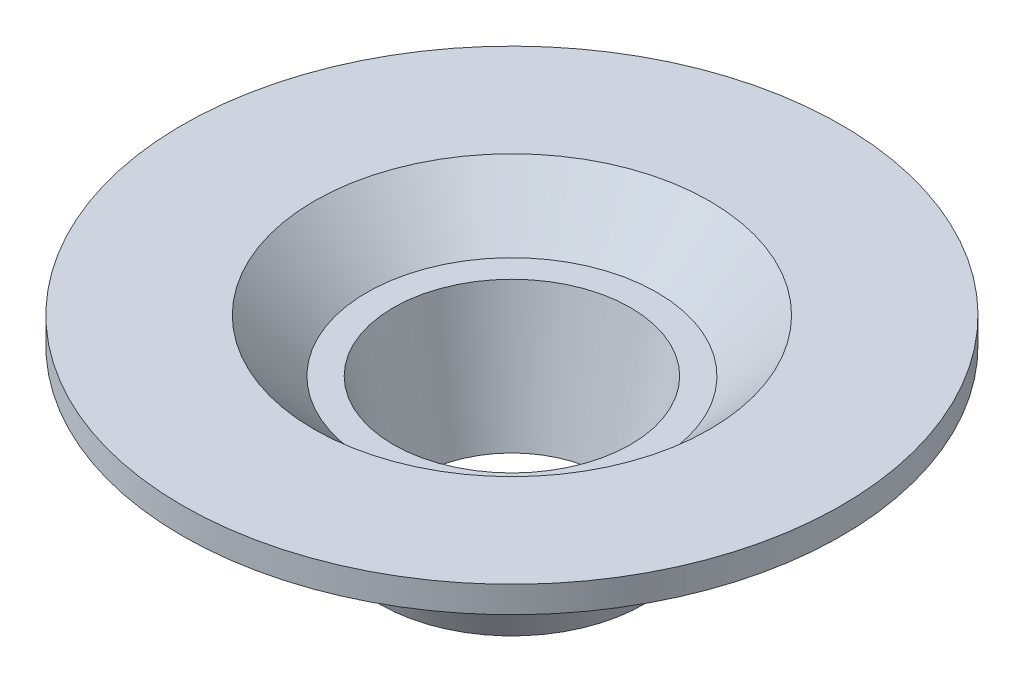
ISO-10303-21;
HEADER;
FILE_DESCRIPTION(('STEP AP214'),'2;1');
FILE_NAME('part.step','',(''),(''),'','','');
FILE_SCHEMA(('AUTOMOTIVE_DESIGN { 1 0 10303 214 1 1 1 1 }'));
ENDSEC;
DATA;
#1=APPLICATION_CONTEXT('core data for automotive mechanical design processes');
#2=APPLICATION_PROTOCOL_DEFINITION('international standard','automotive_design',2000,#1);
#3=PRODUCT_CONTEXT('',#1,'mechanical');
#4=PRODUCT('Part','Part','',(#3));
#5=PRODUCT_RELATED_PRODUCT_CATEGORY('part','',(#4));
#6=PRODUCT_DEFINITION_FORMATION('','',#4);
#7=PRODUCT_DEFINITION_CONTEXT('part definition',#1,'design');
#8=PRODUCT_DEFINITION('design','',#6,#7);
#9=PRODUCT_DEFINITION_SHAPE('','',#8);
#10=(LENGTH_UNIT() NAMED_UNIT(*) SI_UNIT(.MILLI.,.METRE.));
#11=(NAMED_UNIT(*) PLANE_ANGLE_UNIT() SI_UNIT($,.RADIAN.));
#12=(NAMED_UNIT(*) SI_UNIT($,.STERADIAN.) SOLID_ANGLE_UNIT());
#13=UNCERTAINTY_MEASURE_WITH_UNIT(LENGTH_MEASURE(1.E-05),#10,'distance_accuracy_value','');
#14=(GEOMETRIC_REPRESENTATION_CONTEXT(3) GLOBAL_UNCERTAINTY_ASSIGNED_CONTEXT((#13)) GLOBAL_UNIT_ASSIGNED_CONTEXT((#10,
#11,#12)) REPRESENTATION_CONTEXT('',''));
#15=CARTESIAN_POINT('',(0.,0.,0.));
#16=DIRECTION('',(0.,0.,1.));
#17=DIRECTION('',(1.,0.,0.));
#18=AXIS2_PLACEMENT_3D('',#15,#16,#17);
#19=CARTESIAN_POINT('',(0.,0.,-5.5));
#20=DIRECTION('',(0.,-1.,0.));
#21=DIRECTION('',(0.,0.,-1.));
#22=AXIS2_PLACEMENT_3D('',#19,#20,#21);
#23=PLANE('',#22);
#24=CARTESIAN_POINT('',(0.,0.,0.));
#25=DIRECTION('',(0.,1.,0.));
#26=DIRECTION('',(0.,0.,1.));
#27=AXIS2_PLACEMENT_3D('',#24,#25,#26);
#28=CIRCLE('',#27,4.5);
#29=CARTESIAN_POINT('',(0.,0.,4.5));
#30=VERTEX_POINT('',#29);
#31=EDGE_CURVE('E73',#30,#30,#28,.T.);
#32=ORIENTED_EDGE('',*,*,#31,.F.);
#33=EDGE_LOOP('',(#32));
#34=FACE_BOUND('',#33,.T.);
#35=CARTESIAN_POINT('',(0.,0.,0.));
#36=DIRECTION('',(0.,1.,0.));
#37=DIRECTION('',(0.,0.,1.));
#38=AXIS2_PLACEMENT_3D('',#35,#36,#37);
#39=CIRCLE('',#38,5.5);
#40=CARTESIAN_POINT('',(0.,0.,5.5));
#41=VERTEX_POINT('',#40);
#42=EDGE_CURVE('E10',#41,#41,#39,.T.);
#43=ORIENTED_EDGE('',*,*,#42,.T.);
#44=EDGE_LOOP('',(#43));
#45=FACE_BOUND('',#44,.T.);
#46=ADVANCED_FACE('F39',(#34,#45),#23,.F.);
#47=CARTESIAN_POINT('',(0.,2.,0.));
#48=DIRECTION('',(0.,1.,0.));
#49=DIRECTION('',(0.,0.,1.));
#50=AXIS2_PLACEMENT_3D('',#47,#48,#49);
#51=CONICAL_SURFACE('',#50,7.5,0.785398163397448);
#52=ORIENTED_EDGE('',*,*,#42,.F.);
#53=EDGE_LOOP('',(#52));
#54=FACE_BOUND('',#53,.T.);
#55=CARTESIAN_POINT('',(0.,2.,0.));
#56=DIRECTION('',(0.,1.,0.));
#57=DIRECTION('',(0.,0.,1.));
#58=AXIS2_PLACEMENT_3D('',#55,#56,#57);
#59=CIRCLE('',#58,7.5);
#60=CARTESIAN_POINT('',(0.,2.,7.5));
#61=VERTEX_POINT('',#60);
#62=EDGE_CURVE('E45',#61,#61,#59,.T.);
#63=ORIENTED_EDGE('',*,*,#62,.T.);
#64=EDGE_LOOP('',(#63));
#65=FACE_BOUND('',#64,.T.);
#66=ADVANCED_FACE('F80',(#54,#65),#51,.F.);
#67=CARTESIAN_POINT('',(0.,2.,-12.5));
#68=DIRECTION('',(0.,-1.,0.));
#69=DIRECTION('',(0.,0.,-1.));
#70=AXIS2_PLACEMENT_3D('',#67,#68,#69);
#71=PLANE('',#70);
#72=ORIENTED_EDGE('',*,*,#62,.F.);
#73=EDGE_LOOP('',(#72));
#74=FACE_BOUND('',#73,.T.);
#75=CARTESIAN_POINT('',(0.,2.,0.));
#76=DIRECTION('',(0.,1.,0.));
#77=DIRECTION('',(0.,0.,1.));
#78=AXIS2_PLACEMENT_3D('',#75,#76,#77);
#79=CIRCLE('',#78,12.5);
#80=CARTESIAN_POINT('',(0.,2.,12.5));
#81=VERTEX_POINT('',#80);
#82=EDGE_CURVE('E49',#81,#81,#79,.T.);
#83=ORIENTED_EDGE('',*,*,#82,.T.);
#84=EDGE_LOOP('',(#83));
#85=FACE_BOUND('',#84,.T.);
#86=ADVANCED_FACE('F84',(#74,#85),#71,.F.);
#87=CARTESIAN_POINT('',(0.,0.,0.));
#88=DIRECTION('',(0.,1.,0.));
#89=DIRECTION('',(0.,0.,1.));
#90=AXIS2_PLACEMENT_3D('',#87,#88,#89);
#91=CYLINDRICAL_SURFACE('',#90,12.5);
#92=ORIENTED_EDGE('',*,*,#82,.F.);
#93=EDGE_LOOP('',(#92));
#94=FACE_BOUND('',#93,.T.);
#95=CARTESIAN_POINT('',(0.,1.,0.));
#96=DIRECTION('',(0.,1.,0.));
#97=DIRECTION('',(0.,0.,1.));
#98=AXIS2_PLACEMENT_3D('',#95,#96,#97);
#99=CIRCLE('',#98,12.5);
#100=CARTESIAN_POINT('',(0.,1.,12.5));
#101=VERTEX_POINT('',#100);
#102=EDGE_CURVE('E53',#101,#101,#99,.T.);
#103=ORIENTED_EDGE('',*,*,#102,.T.);
#104=EDGE_LOOP('',(#103));
#105=FACE_BOUND('',#104,.T.);
#106=ADVANCED_FACE('F89',(#94,#105),#91,.T.);
#107=CARTESIAN_POINT('',(0.,1.,-10.5));
#108=DIRECTION('',(0.,1.,0.));
#109=DIRECTION('',(0.,0.,1.));
#110=AXIS2_PLACEMENT_3D('',#107,#108,#109);
#111=PLANE('',#110);
#112=ORIENTED_EDGE('',*,*,#102,.F.);
#113=EDGE_LOOP('',(#112));
#114=FACE_BOUND('',#113,.T.);
#115=CARTESIAN_POINT('',(0.,1.,0.));
#116=DIRECTION('',(0.,1.,0.));
#117=DIRECTION('',(0.,0.,1.));
#118=AXIS2_PLACEMENT_3D('',#115,#116,#117);
#119=CIRCLE('',#118,10.5);
#120=CARTESIAN_POINT('',(0.,1.,10.5));
#121=VERTEX_POINT('',#120);
#122=EDGE_CURVE('E58',#121,#121,#119,.T.);
#123=ORIENTED_EDGE('',*,*,#122,.T.);
#124=EDGE_LOOP('',(#123));
#125=FACE_BOUND('',#124,.T.);
#126=ADVANCED_FACE('F95',(#114,#125),#111,.F.);
#127=CARTESIAN_POINT('',(0.,-1.,0.));
#128=DIRECTION('',(0.,1.,0.));
#129=DIRECTION('',(0.,0.,1.));
#130=AXIS2_PLACEMENT_3D('',#127,#128,#129);
#131=CONICAL_SURFACE('',#130,8.5,0.785398163397448);
#132=ORIENTED_EDGE('',*,*,#122,.F.);
#133=EDGE_LOOP('',(#132));
#134=FACE_BOUND('',#133,.T.);
#135=CARTESIAN_POINT('',(0.,-1.,0.));
#136=DIRECTION('',(0.,1.,0.));
#137=DIRECTION('',(0.,0.,1.));
#138=AXIS2_PLACEMENT_3D('',#135,#136,#137);
#139=CIRCLE('',#138,8.5);
#140=CARTESIAN_POINT('',(0.,-1.,8.5));
#141=VERTEX_POINT('',#140);
#142=EDGE_CURVE('E61',#141,#141,#139,.T.);
#143=ORIENTED_EDGE('',*,*,#142,.T.);
#144=EDGE_LOOP('',(#143));
#145=FACE_BOUND('',#144,.T.);
#146=ADVANCED_FACE('F99',(#134,#145),#131,.T.);
#147=CARTESIAN_POINT('',(0.,-1.,-6.5));
#148=DIRECTION('',(0.,1.,0.));
#149=DIRECTION('',(0.,0.,1.));
#150=AXIS2_PLACEMENT_3D('',#147,#148,#149);
#151=PLANE('',#150);
#152=ORIENTED_EDGE('',*,*,#142,.F.);
#153=EDGE_LOOP('',(#152));
#154=FACE_BOUND('',#153,.T.);
#155=CARTESIAN_POINT('',(0.,-1.,0.));
#156=DIRECTION('',(0.,1.,0.));
#157=DIRECTION('',(0.,0.,1.));
#158=AXIS2_PLACEMENT_3D('',#155,#156,#157);
#159=CIRCLE('',#158,6.5);
#160=CARTESIAN_POINT('',(0.,-1.,6.5));
#161=VERTEX_POINT('',#160);
#162=EDGE_CURVE('E64',#161,#161,#159,.T.);
#163=ORIENTED_EDGE('',*,*,#162,.T.);
#164=EDGE_LOOP('',(#163));
#165=FACE_BOUND('',#164,.T.);
#166=ADVANCED_FACE('F103',(#154,#165),#151,.F.);
#167=CARTESIAN_POINT('',(0.,-5.,0.));
#168=DIRECTION('',(0.,1.,0.));
#169=DIRECTION('',(0.,0.,1.));
#170=AXIS2_PLACEMENT_3D('',#167,#168,#169);
#171=CONICAL_SURFACE('',#170,5.,0.358770670270572);
#172=ORIENTED_EDGE('',*,*,#162,.F.);
#173=EDGE_LOOP('',(#172));
#174=FACE_BOUND('',#173,.T.);
#175=CARTESIAN_POINT('',(0.,-5.,0.));
#176=DIRECTION('',(0.,1.,0.));
#177=DIRECTION('',(0.,0.,1.));
#178=AXIS2_PLACEMENT_3D('',#175,#176,#177);
#179=CIRCLE('',#178,5.);
#180=CARTESIAN_POINT('',(0.,-5.,5.));
#181=VERTEX_POINT('',#180);
#182=EDGE_CURVE('E67',#181,#181,#179,.T.);
#183=ORIENTED_EDGE('',*,*,#182,.T.);
#184=EDGE_LOOP('',(#183));
#185=FACE_BOUND('',#184,.T.);
#186=ADVANCED_FACE('F107',(#174,#185),#171,.T.);
#187=CARTESIAN_POINT('',(0.,-5.,-3.5));
#188=DIRECTION('',(0.,1.,0.));
#189=DIRECTION('',(0.,0.,1.));
#190=AXIS2_PLACEMENT_3D('',#187,#188,#189);
#191=PLANE('',#190);
#192=ORIENTED_EDGE('',*,*,#182,.F.);
#193=EDGE_LOOP('',(#192));
#194=FACE_BOUND('',#193,.T.);
#195=CARTESIAN_POINT('',(0.,-5.,0.));
#196=DIRECTION('',(0.,1.,0.));
#197=DIRECTION('',(0.,0.,1.));
#198=AXIS2_PLACEMENT_3D('',#195,#196,#197);
#199=CIRCLE('',#198,3.5);
#200=CARTESIAN_POINT('',(0.,-5.,3.5));
#201=VERTEX_POINT('',#200);
#202=EDGE_CURVE('E70',#201,#201,#199,.T.);
#203=ORIENTED_EDGE('',*,*,#202,.T.);
#204=EDGE_LOOP('',(#203));
#205=FACE_BOUND('',#204,.T.);
#206=ADVANCED_FACE('F111',(#194,#205),#191,.F.);
#207=CARTESIAN_POINT('',(0.,0.,0.));
#208=DIRECTION('',(0.,1.,0.));
#209=DIRECTION('',(0.,0.,1.));
#210=AXIS2_PLACEMENT_3D('',#207,#208,#209);
#211=CONICAL_SURFACE('',#210,4.5,0.197395559849881);
#212=ORIENTED_EDGE('',*,*,#202,.F.);
#213=EDGE_LOOP('',(#212));
#214=FACE_BOUND('',#213,.T.);
#215=ORIENTED_EDGE('',*,*,#31,.T.);
#216=EDGE_LOOP('',(#215));
#217=FACE_BOUND('',#216,.T.);
#218=ADVANCED_FACE('F77',(#214,#217),#211,.F.);
#219=CLOSED_SHELL('',(#46,#66,#86,#106,#126,#146,#166,#186,#206,#218));
#220=MANIFOLD_SOLID_BREP('B2',#219);
#221=ADVANCED_BREP_SHAPE_REPRESENTATION('',(#18,#220),#14);
#222=SHAPE_DEFINITION_REPRESENTATION(#9,#221);
ENDSEC;
END-ISO-10303-21;
